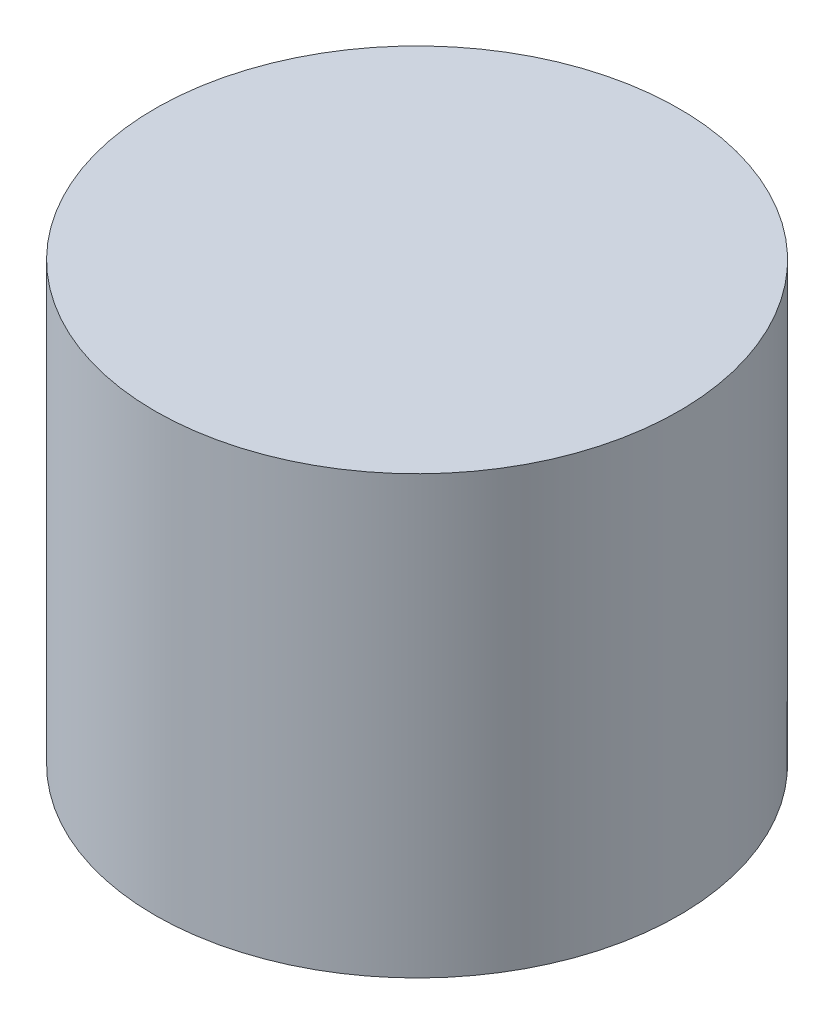
ISO-10303-21;
HEADER;
FILE_DESCRIPTION(('STEP AP214'),'2;1');
FILE_NAME('part.step','',(''),(''),'','','');
FILE_SCHEMA(('AUTOMOTIVE_DESIGN { 1 0 10303 214 1 1 1 1 }'));
ENDSEC;
DATA;
#1=APPLICATION_CONTEXT('core data for automotive mechanical design processes');
#2=APPLICATION_PROTOCOL_DEFINITION('international standard','automotive_design',2000,#1);
#3=PRODUCT_CONTEXT('',#1,'mechanical');
#4=PRODUCT('Part','Part','',(#3));
#5=PRODUCT_RELATED_PRODUCT_CATEGORY('part','',(#4));
#6=PRODUCT_DEFINITION_FORMATION('','',#4);
#7=PRODUCT_DEFINITION_CONTEXT('part definition',#1,'design');
#8=PRODUCT_DEFINITION('design','',#6,#7);
#9=PRODUCT_DEFINITION_SHAPE('','',#8);
#10=(LENGTH_UNIT() NAMED_UNIT(*) SI_UNIT(.MILLI.,.METRE.));
#11=(NAMED_UNIT(*) PLANE_ANGLE_UNIT() SI_UNIT($,.RADIAN.));
#12=(NAMED_UNIT(*) SI_UNIT($,.STERADIAN.) SOLID_ANGLE_UNIT());
#13=UNCERTAINTY_MEASURE_WITH_UNIT(LENGTH_MEASURE(1.E-05),#10,'distance_accuracy_value','');
#14=(GEOMETRIC_REPRESENTATION_CONTEXT(3) GLOBAL_UNCERTAINTY_ASSIGNED_CONTEXT((#13)) GLOBAL_UNIT_ASSIGNED_CONTEXT((#10,
#11,#12)) REPRESENTATION_CONTEXT('',''));
#15=CARTESIAN_POINT('',(0.,0.,0.));
#16=DIRECTION('',(0.,0.,1.));
#17=DIRECTION('',(1.,0.,0.));
#18=AXIS2_PLACEMENT_3D('',#15,#16,#17);
#19=CARTESIAN_POINT('',(0.,150.,0.));
#20=DIRECTION('',(0.,-1.,0.));
#21=DIRECTION('',(0.,0.,-1.));
#22=AXIS2_PLACEMENT_3D('',#19,#20,#21);
#23=CYLINDRICAL_SURFACE('',#22,90.);
#24=CARTESIAN_POINT('',(0.,150.,0.));
#25=DIRECTION('',(0.,1.,0.));
#26=DIRECTION('',(0.,0.,1.));
#27=AXIS2_PLACEMENT_3D('',#24,#25,#26);
#28=CIRCLE('',#27,90.);
#29=CARTESIAN_POINT('',(0.,150.,90.));
#30=VERTEX_POINT('',#29);
#31=EDGE_CURVE('E58',#30,#30,#28,.T.);
#32=ORIENTED_EDGE('',*,*,#31,.F.);
#33=EDGE_LOOP('',(#32));
#34=FACE_BOUND('',#33,.T.);
#35=CARTESIAN_POINT('',(0.,0.,0.));
#36=DIRECTION('',(0.,1.,0.));
#37=DIRECTION('',(0.,0.,1.));
#38=AXIS2_PLACEMENT_3D('',#35,#36,#37);
#39=CIRCLE('',#38,90.);
#40=CARTESIAN_POINT('',(0.,0.,90.));
#41=VERTEX_POINT('',#40);
#42=EDGE_CURVE('E60',#41,#41,#39,.T.);
#43=ORIENTED_EDGE('',*,*,#42,.T.);
#44=EDGE_LOOP('',(#43));
#45=FACE_BOUND('',#44,.T.);
#46=ADVANCED_FACE('F44',(#34,#45),#23,.T.);
#47=CARTESIAN_POINT('',(0.,150.,0.));
#48=DIRECTION('',(0.,1.,0.));
#49=DIRECTION('',(0.,0.,1.));
#50=AXIS2_PLACEMENT_3D('',#47,#48,#49);
#51=PLANE('',#50);
#52=ORIENTED_EDGE('',*,*,#31,.T.);
#53=EDGE_LOOP('',(#52));
#54=FACE_BOUND('',#53,.T.);
#55=ADVANCED_FACE('F68',(#54),#51,.T.);
#56=CARTESIAN_POINT('',(0.,0.,0.));
#57=DIRECTION('',(0.,1.,0.));
#58=DIRECTION('',(0.,0.,1.));
#59=AXIS2_PLACEMENT_3D('',#56,#57,#58);
#60=PLANE('',#59);
#61=ORIENTED_EDGE('',*,*,#42,.F.);
#62=EDGE_LOOP('',(#61));
#63=FACE_BOUND('',#62,.T.);
#64=ADVANCED_FACE('F75',(#63),#60,.F.);
#65=CLOSED_SHELL('',(#46,#55,#64));
#66=CARTESIAN_POINT('',(0.,150.,0.));
#67=DIRECTION('',(0.,-1.,0.));
#68=DIRECTION('',(0.,0.,-1.));
#69=AXIS2_PLACEMENT_3D('',#66,#67,#68);
#70=CYLINDRICAL_SURFACE('',#69,78.);
#71=CARTESIAN_POINT('',(0.,138.,0.));
#72=DIRECTION('',(0.,1.,0.));
#73=DIRECTION('',(0.,0.,1.));
#74=AXIS2_PLACEMENT_3D('',#71,#72,#73);
#75=CIRCLE('',#74,78.);
#76=CARTESIAN_POINT('',(0.,138.,78.));
#77=VERTEX_POINT('',#76);
#78=EDGE_CURVE('E10',#77,#77,#75,.T.);
#79=ORIENTED_EDGE('',*,*,#78,.T.);
#80=EDGE_LOOP('',(#79));
#81=FACE_BOUND('',#80,.T.);
#82=CARTESIAN_POINT('',(0.,12.,0.));
#83=DIRECTION('',(0.,1.,0.));
#84=DIRECTION('',(0.,0.,1.));
#85=AXIS2_PLACEMENT_3D('',#82,#83,#84);
#86=CIRCLE('',#85,78.);
#87=CARTESIAN_POINT('',(0.,12.,78.));
#88=VERTEX_POINT('',#87);
#89=EDGE_CURVE('E48',#88,#88,#86,.T.);
#90=ORIENTED_EDGE('',*,*,#89,.F.);
#91=EDGE_LOOP('',(#90));
#92=FACE_BOUND('',#91,.T.);
#93=ADVANCED_FACE('F84',(#81,#92),#70,.F.);
#94=CARTESIAN_POINT('',(0.,138.,0.));
#95=DIRECTION('',(0.,1.,0.));
#96=DIRECTION('',(0.,0.,1.));
#97=AXIS2_PLACEMENT_3D('',#94,#95,#96);
#98=PLANE('',#97);
#99=ORIENTED_EDGE('',*,*,#78,.F.);
#100=EDGE_LOOP('',(#99));
#101=FACE_BOUND('',#100,.T.);
#102=ADVANCED_FACE('F85',(#101),#98,.F.);
#103=CARTESIAN_POINT('',(0.,12.,0.));
#104=DIRECTION('',(0.,1.,0.));
#105=DIRECTION('',(0.,0.,1.));
#106=AXIS2_PLACEMENT_3D('',#103,#104,#105);
#107=PLANE('',#106);
#108=ORIENTED_EDGE('',*,*,#89,.T.);
#109=EDGE_LOOP('',(#108));
#110=FACE_BOUND('',#109,.T.);
#111=ADVANCED_FACE('F46',(#110),#107,.T.);
#112=CLOSED_SHELL('',(#93,#102,#111));
#113=ORIENTED_CLOSED_SHELL('',*,#112,.T.);
#114=BREP_WITH_VOIDS('B2',#65,(#113));
#115=ADVANCED_BREP_SHAPE_REPRESENTATION('',(#18,#114),#14);
#116=SHAPE_DEFINITION_REPRESENTATION(#9,#115);
ENDSEC;
END-ISO-10303-21;
